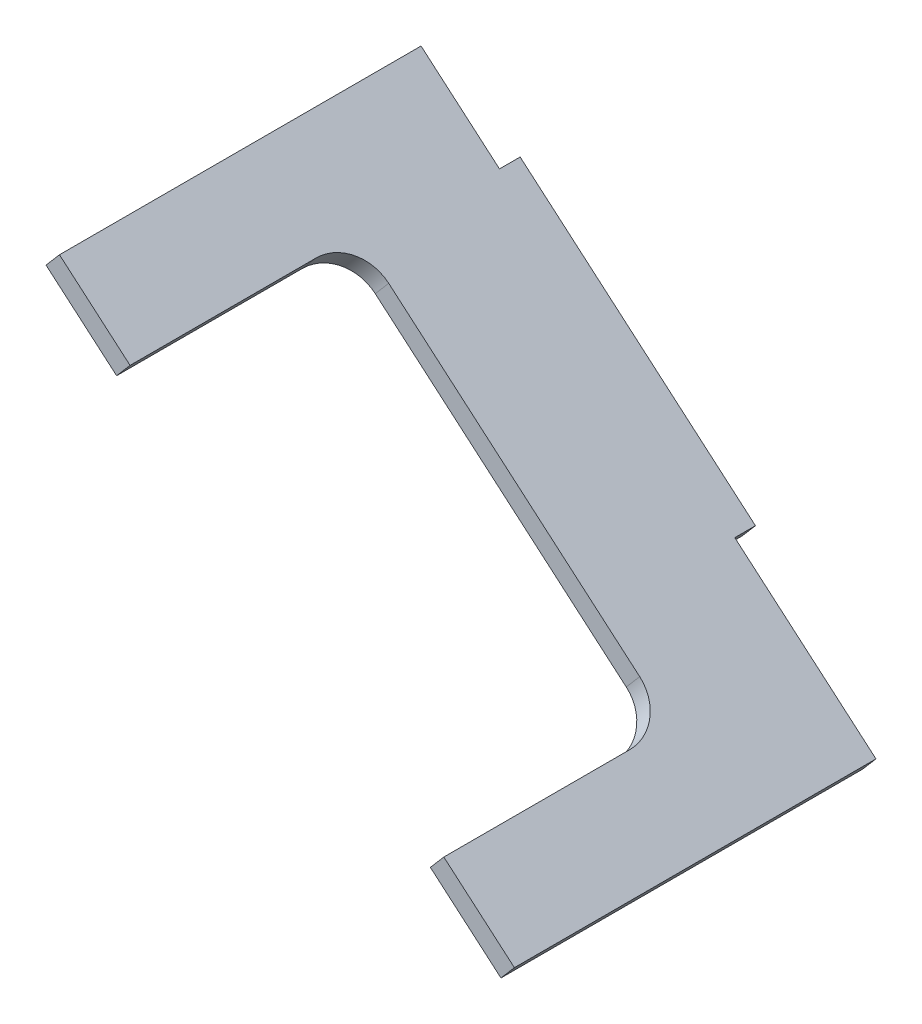
ISO-10303-21;
HEADER;
FILE_DESCRIPTION(('STEP AP214'),'2;1');
FILE_NAME('part.step','',(''),(''),'','','');
FILE_SCHEMA(('AUTOMOTIVE_DESIGN { 1 0 10303 214 1 1 1 1 }'));
ENDSEC;
DATA;
#1=APPLICATION_CONTEXT('core data for automotive mechanical design processes');
#2=APPLICATION_PROTOCOL_DEFINITION('international standard','automotive_design',2000,#1);
#3=PRODUCT_CONTEXT('',#1,'mechanical');
#4=PRODUCT('Part','Part','',(#3));
#5=PRODUCT_RELATED_PRODUCT_CATEGORY('part','',(#4));
#6=PRODUCT_DEFINITION_FORMATION('','',#4);
#7=PRODUCT_DEFINITION_CONTEXT('part definition',#1,'design');
#8=PRODUCT_DEFINITION('design','',#6,#7);
#9=PRODUCT_DEFINITION_SHAPE('','',#8);
#10=(LENGTH_UNIT() NAMED_UNIT(*) SI_UNIT(.MILLI.,.METRE.));
#11=(NAMED_UNIT(*) PLANE_ANGLE_UNIT() SI_UNIT($,.RADIAN.));
#12=(NAMED_UNIT(*) SI_UNIT($,.STERADIAN.) SOLID_ANGLE_UNIT());
#13=UNCERTAINTY_MEASURE_WITH_UNIT(LENGTH_MEASURE(1.E-05),#10,'distance_accuracy_value','');
#14=(GEOMETRIC_REPRESENTATION_CONTEXT(3) GLOBAL_UNCERTAINTY_ASSIGNED_CONTEXT((#13)) GLOBAL_UNIT_ASSIGNED_CONTEXT((#10,
#11,#12)) REPRESENTATION_CONTEXT('',''));
#15=CARTESIAN_POINT('',(0.,0.,0.));
#16=DIRECTION('',(0.,0.,1.));
#17=DIRECTION('',(1.,0.,0.));
#18=AXIS2_PLACEMENT_3D('',#15,#16,#17);
#19=CARTESIAN_POINT('',(-143.999999999999,-1.79066830807706E-12,35.));
#20=DIRECTION('',(0.,0.,-1.));
#21=DIRECTION('',(0.,1.,0.));
#22=AXIS2_PLACEMENT_3D('',#19,#20,#21);
#23=PLANE('',#22);
#24=DIRECTION('',(-0.759272473775862,0.650772856353339,0.));
#25=VECTOR('',#24,1.);
#26=CARTESIAN_POINT('',(30.6663228878355,65.0384694265857,35.));
#27=LINE('',#26,#25);
#28=CARTESIAN_POINT('',(29.9070504140597,65.6892422829391,35.));
#29=VERTEX_POINT('',#28);
#30=CARTESIAN_POINT('',(23.0735981500769,71.5461979901191,35.));
#31=VERTEX_POINT('',#30);
#32=EDGE_CURVE('E147',#29,#31,#27,.T.);
#33=ORIENTED_EDGE('',*,*,#32,.F.);
#34=DIRECTION('',(0.650772856353339,0.759272473775862,0.));
#35=VECTOR('',#34,1.);
#36=CARTESIAN_POINT('',(-76.2014777581834,-58.1101508348213,35.));
#37=LINE('',#36,#35);
#38=CARTESIAN_POINT('',(31.2085961267664,67.2077872304908,35.));
#39=VERTEX_POINT('',#38);
#40=EDGE_CURVE('E136',#29,#39,#37,.T.);
#41=ORIENTED_EDGE('',*,*,#40,.T.);
#42=DIRECTION('',(0.759272473775862,-0.650772856353339,0.));
#43=VECTOR('',#42,1.);
#44=CARTESIAN_POINT('',(54.746042813818,47.0338286835373,35.));
#45=LINE('',#44,#43);
#46=CARTESIAN_POINT('',(24.3751438627836,73.0647429376708,35.));
#47=VERTEX_POINT('',#46);
#48=EDGE_CURVE('E145',#47,#39,#45,.T.);
#49=ORIENTED_EDGE('',*,*,#48,.F.);
#50=DIRECTION('',(-0.650772856353339,-0.759272473775862,0.));
#51=VECTOR('',#50,1.);
#52=CARTESIAN_POINT('',(49.9878306813736,102.947685796981,35.));
#53=LINE('',#52,#51);
#54=EDGE_CURVE('E214',#47,#31,#53,.T.);
#55=ORIENTED_EDGE('',*,*,#54,.T.);
#56=EDGE_LOOP('',(#33,#41,#49,#55));
#57=FACE_BOUND('',#56,.T.);
#58=ADVANCED_FACE('F33',(#57),#23,.F.);
#59=CARTESIAN_POINT('',(31.9678686005422,66.5570143741374,66.9779195690136));
#60=DIRECTION('',(0.759272473775864,-0.650772856353336,0.));
#61=DIRECTION('',(0.650772856353336,0.759272473775864,0.));
#62=AXIS2_PLACEMENT_3D('',#59,#60,#61);
#63=PLANE('',#62);
#64=DIRECTION('',(-0.650772856353339,-0.759272473775862,0.));
#65=VECTOR('',#64,1.);
#66=CARTESIAN_POINT('',(57.5805554191322,96.4399572334481,0.));
#67=LINE('',#66,#65);
#68=CARTESIAN_POINT('',(31.9678686005422,66.5570143741374,0.));
#69=VERTEX_POINT('',#68);
#70=CARTESIAN_POINT('',(30.6663228878355,65.0384694265857,0.));
#71=VERTEX_POINT('',#70);
#72=EDGE_CURVE('E197',#69,#71,#67,.T.);
#73=ORIENTED_EDGE('',*,*,#72,.F.);
#74=DIRECTION('',(0.,0.,-1.));
#75=VECTOR('',#74,1.);
#76=CARTESIAN_POINT('',(31.9678686005422,66.5570143741374,66.9779195690136));
#77=LINE('',#76,#75);
#78=CARTESIAN_POINT('',(31.9678686005422,66.5570143741374,-1.99999999999999));
#79=VERTEX_POINT('',#78);
#80=EDGE_CURVE('E210',#69,#79,#77,.T.);
#81=ORIENTED_EDGE('',*,*,#80,.T.);
#82=DIRECTION('',(-0.650772856353336,-0.759272473775864,0.));
#83=VECTOR('',#82,1.);
#84=CARTESIAN_POINT('',(31.9678686005422,66.5570143741374,-1.99999999999999));
#85=LINE('',#84,#83);
#86=CARTESIAN_POINT('',(30.6663228878355,65.0384694265857,-1.99999999999999));
#87=VERTEX_POINT('',#86);
#88=EDGE_CURVE('E162',#79,#87,#85,.T.);
#89=ORIENTED_EDGE('',*,*,#88,.T.);
#90=DIRECTION('',(0.,0.,-1.));
#91=VECTOR('',#90,1.);
#92=CARTESIAN_POINT('',(30.6663228878355,65.0384694265857,66.9779195690136));
#93=LINE('',#92,#91);
#94=EDGE_CURVE('E172',#71,#87,#93,.T.);
#95=ORIENTED_EDGE('',*,*,#94,.F.);
#96=EDGE_LOOP('',(#73,#81,#89,#95));
#97=FACE_BOUND('',#96,.T.);
#98=ADVANCED_FACE('F238',(#97),#63,.F.);
#99=CARTESIAN_POINT('',(30.6663228878355,65.0384694265857,66.9779195690136));
#100=DIRECTION('',(0.650772856353339,0.759272473775862,0.));
#101=DIRECTION('',(-0.759272473775862,0.650772856353339,0.));
#102=AXIS2_PLACEMENT_3D('',#99,#100,#101);
#103=PLANE('',#102);
#104=DIRECTION('',(0.,0.,-1.));
#105=VECTOR('',#104,1.);
#106=CARTESIAN_POINT('',(60.2779493650941,39.6583280288055,66.9779195690136));
#107=LINE('',#106,#105);
#108=CARTESIAN_POINT('',(60.2779493650942,39.6583280288055,35.));
#109=VERTEX_POINT('',#108);
#110=CARTESIAN_POINT('',(60.2779493650941,39.6583280288055,17.));
#111=VERTEX_POINT('',#110);
#112=EDGE_CURVE('E339',#109,#111,#107,.T.);
#113=ORIENTED_EDGE('',*,*,#112,.T.);
#114=CARTESIAN_POINT('',(57.2408594699907,42.2614194542188,17.));
#115=DIRECTION('',(0.650772856353339,0.759272473775862,0.));
#116=DIRECTION('',(-0.759272473775862,0.650772856353339,0.));
#117=AXIS2_PLACEMENT_3D('',#114,#115,#116);
#118=CIRCLE('',#117,4.);
#119=CARTESIAN_POINT('',(57.2408594699907,42.2614194542188,13.));
#120=VERTEX_POINT('',#119);
#121=EDGE_CURVE('E328',#111,#120,#118,.T.);
#122=ORIENTED_EDGE('',*,*,#121,.T.);
#123=DIRECTION('',(-0.759272473775862,0.650772856353339,0.));
#124=VECTOR('',#123,1.);
#125=CARTESIAN_POINT('',(30.6663228878355,65.0384694265857,13.));
#126=LINE('',#125,#124);
#127=CARTESIAN_POINT('',(32.9441403091631,63.0861508575257,13.));
#128=VERTEX_POINT('',#127);
#129=EDGE_CURVE('E181',#120,#128,#126,.T.);
#130=ORIENTED_EDGE('',*,*,#129,.T.);
#131=CARTESIAN_POINT('',(32.9441403091631,63.0861508575257,17.));
#132=DIRECTION('',(0.650772856353339,0.759272473775862,0.));
#133=DIRECTION('',(-0.759272473775862,0.650772856353339,0.));
#134=AXIS2_PLACEMENT_3D('',#131,#132,#133);
#135=CIRCLE('',#134,4.);
#136=CARTESIAN_POINT('',(29.9070504140597,65.689242282939,17.));
#137=VERTEX_POINT('',#136);
#138=EDGE_CURVE('E11',#128,#137,#135,.T.);
#139=ORIENTED_EDGE('',*,*,#138,.T.);
#140=DIRECTION('',(0.,0.,1.));
#141=VECTOR('',#140,1.);
#142=CARTESIAN_POINT('',(29.9070504140597,65.689242282939,66.9779195690136));
#143=LINE('',#142,#141);
#144=EDGE_CURVE('E246',#137,#29,#143,.T.);
#145=ORIENTED_EDGE('',*,*,#144,.T.);
#146=ORIENTED_EDGE('',*,*,#32,.T.);
#147=DIRECTION('',(0.,0.,-1.));
#148=VECTOR('',#147,1.);
#149=CARTESIAN_POINT('',(23.0735981500769,71.5461979901191,0.));
#150=LINE('',#149,#148);
#151=CARTESIAN_POINT('',(23.0735981500769,71.5461979901191,0.));
#152=VERTEX_POINT('',#151);
#153=EDGE_CURVE('E198',#31,#152,#150,.T.);
#154=ORIENTED_EDGE('',*,*,#153,.T.);
#155=DIRECTION('',(0.759272473775862,-0.650772856353338,0.));
#156=VECTOR('',#155,1.);
#157=CARTESIAN_POINT('',(30.6663228878355,65.0384694265857,0.));
#158=LINE('',#157,#156);
#159=EDGE_CURVE('E201',#152,#71,#158,.T.);
#160=ORIENTED_EDGE('',*,*,#159,.T.);
#161=ORIENTED_EDGE('',*,*,#94,.T.);
#162=DIRECTION('',(0.759272473775862,-0.650772856353339,0.));
#163=VECTOR('',#162,1.);
#164=CARTESIAN_POINT('',(30.6663228878355,65.0384694265857,-1.99999999999999));
#165=LINE('',#164,#163);
#166=CARTESIAN_POINT('',(53.4444971011114,45.5152837359855,-1.99999999999999));
#167=VERTEX_POINT('',#166);
#168=EDGE_CURVE('E225',#87,#167,#165,.T.);
#169=ORIENTED_EDGE('',*,*,#168,.T.);
#170=DIRECTION('',(0.,0.,-1.));
#171=VECTOR('',#170,1.);
#172=CARTESIAN_POINT('',(53.4444971011114,45.5152837359855,66.9779195690136));
#173=LINE('',#172,#171);
#174=CARTESIAN_POINT('',(53.4444971011114,45.5152837359855,0.));
#175=VERTEX_POINT('',#174);
#176=EDGE_CURVE('E169',#175,#167,#173,.T.);
#177=ORIENTED_EDGE('',*,*,#176,.F.);
#178=DIRECTION('',(0.759272473775862,-0.650772856353339,0.));
#179=VECTOR('',#178,1.);
#180=CARTESIAN_POINT('',(53.4444971011114,45.5152837359855,0.));
#181=LINE('',#180,#179);
#182=CARTESIAN_POINT('',(67.1114016290769,33.8013723216254,0.));
#183=VERTEX_POINT('',#182);
#184=EDGE_CURVE('E177',#175,#183,#181,.T.);
#185=ORIENTED_EDGE('',*,*,#184,.T.);
#186=DIRECTION('',(0.,0.,1.));
#187=VECTOR('',#186,1.);
#188=CARTESIAN_POINT('',(67.1114016290769,33.8013723216254,0.));
#189=LINE('',#188,#187);
#190=CARTESIAN_POINT('',(67.1114016290769,33.8013723216254,35.));
#191=VERTEX_POINT('',#190);
#192=EDGE_CURVE('E180',#183,#191,#189,.T.);
#193=ORIENTED_EDGE('',*,*,#192,.T.);
#194=EDGE_CURVE('E159',#191,#109,#27,.T.);
#195=ORIENTED_EDGE('',*,*,#194,.T.);
#196=EDGE_LOOP('',(#113,#122,#130,#139,#145,#146,#154,#160,#161,#169,#177,#185,#193,#195));
#197=FACE_BOUND('',#196,.T.);
#198=ADVANCED_FACE('F232',(#197),#103,.F.);
#199=CARTESIAN_POINT('',(54.746042813818,47.0338286835373,66.9779195690136));
#200=DIRECTION('',(-0.650772856353338,-0.759272473775862,0.));
#201=DIRECTION('',(0.759272473775862,-0.650772856353339,0.));
#202=AXIS2_PLACEMENT_3D('',#199,#200,#201);
#203=PLANE('',#202);
#204=ORIENTED_EDGE('',*,*,#48,.T.);
#205=DIRECTION('',(0.,0.,1.));
#206=VECTOR('',#205,1.);
#207=CARTESIAN_POINT('',(31.2085961267664,67.2077872304908,35.));
#208=LINE('',#207,#206);
#209=CARTESIAN_POINT('',(31.2085961267664,67.2077872304908,17.));
#210=VERTEX_POINT('',#209);
#211=EDGE_CURVE('E133',#210,#39,#208,.T.);
#212=ORIENTED_EDGE('',*,*,#211,.F.);
#213=CARTESIAN_POINT('',(34.2456860218698,64.6046958050774,17.));
#214=DIRECTION('',(-0.650772856353338,-0.759272473775862,0.));
#215=DIRECTION('',(0.759272473775862,-0.650772856353339,0.));
#216=AXIS2_PLACEMENT_3D('',#213,#214,#215);
#217=CIRCLE('',#216,4.);
#218=CARTESIAN_POINT('',(34.2456860218698,64.6046958050774,13.));
#219=VERTEX_POINT('',#218);
#220=EDGE_CURVE('E41',#210,#219,#217,.T.);
#221=ORIENTED_EDGE('',*,*,#220,.T.);
#222=DIRECTION('',(-0.759272473775862,0.650772856353338,0.));
#223=VECTOR('',#222,1.);
#224=CARTESIAN_POINT('',(31.2085961267664,67.2077872304908,13.));
#225=LINE('',#224,#223);
#226=CARTESIAN_POINT('',(58.5424051826974,43.7799644017706,13.));
#227=VERTEX_POINT('',#226);
#228=EDGE_CURVE('E322',#227,#219,#225,.T.);
#229=ORIENTED_EDGE('',*,*,#228,.F.);
#230=CARTESIAN_POINT('',(58.5424051826974,43.7799644017706,17.));
#231=DIRECTION('',(-0.650772856353338,-0.759272473775862,0.));
#232=DIRECTION('',(0.759272473775862,-0.650772856353339,0.));
#233=AXIS2_PLACEMENT_3D('',#230,#231,#232);
#234=CIRCLE('',#233,4.);
#235=CARTESIAN_POINT('',(61.5794950778008,41.1768729763572,17.));
#236=VERTEX_POINT('',#235);
#237=EDGE_CURVE('E326',#227,#236,#234,.T.);
#238=ORIENTED_EDGE('',*,*,#237,.T.);
#239=DIRECTION('',(0.,0.,-1.));
#240=VECTOR('',#239,1.);
#241=CARTESIAN_POINT('',(61.5794950778008,41.1768729763572,35.));
#242=LINE('',#241,#240);
#243=CARTESIAN_POINT('',(61.5794950778008,41.1768729763572,35.));
#244=VERTEX_POINT('',#243);
#245=EDGE_CURVE('E141',#244,#236,#242,.T.);
#246=ORIENTED_EDGE('',*,*,#245,.F.);
#247=CARTESIAN_POINT('',(68.4129473417836,35.3199172691772,35.));
#248=VERTEX_POINT('',#247);
#249=EDGE_CURVE('E155',#244,#248,#45,.T.);
#250=ORIENTED_EDGE('',*,*,#249,.T.);
#251=DIRECTION('',(0.,0.,-1.));
#252=VECTOR('',#251,1.);
#253=CARTESIAN_POINT('',(68.4129473417836,35.3199172691772,0.));
#254=LINE('',#253,#252);
#255=CARTESIAN_POINT('',(68.4129473417836,35.3199172691771,0.));
#256=VERTEX_POINT('',#255);
#257=EDGE_CURVE('E286',#248,#256,#254,.T.);
#258=ORIENTED_EDGE('',*,*,#257,.T.);
#259=DIRECTION('',(-0.759272473775862,0.650772856353339,0.));
#260=VECTOR('',#259,1.);
#261=CARTESIAN_POINT('',(54.7460428138181,47.0338286835372,0.));
#262=LINE('',#261,#260);
#263=CARTESIAN_POINT('',(54.7460428138181,47.0338286835372,0.));
#264=VERTEX_POINT('',#263);
#265=EDGE_CURVE('E189',#256,#264,#262,.T.);
#266=ORIENTED_EDGE('',*,*,#265,.T.);
#267=DIRECTION('',(0.,0.,-1.));
#268=VECTOR('',#267,1.);
#269=CARTESIAN_POINT('',(54.746042813818,47.0338286835373,66.9779195690136));
#270=LINE('',#269,#268);
#271=CARTESIAN_POINT('',(54.746042813818,47.0338286835373,-1.99999999999999));
#272=VERTEX_POINT('',#271);
#273=EDGE_CURVE('E174',#264,#272,#270,.T.);
#274=ORIENTED_EDGE('',*,*,#273,.T.);
#275=DIRECTION('',(-0.759272473775862,0.650772856353339,0.));
#276=VECTOR('',#275,1.);
#277=CARTESIAN_POINT('',(54.746042813818,47.0338286835373,-1.99999999999999));
#278=LINE('',#277,#276);
#279=EDGE_CURVE('E217',#272,#79,#278,.T.);
#280=ORIENTED_EDGE('',*,*,#279,.T.);
#281=ORIENTED_EDGE('',*,*,#80,.F.);
#282=DIRECTION('',(-0.759272473775862,0.650772856353339,0.));
#283=VECTOR('',#282,1.);
#284=CARTESIAN_POINT('',(31.9678686005422,66.5570143741374,0.));
#285=LINE('',#284,#283);
#286=CARTESIAN_POINT('',(24.3751438627836,73.0647429376708,0.));
#287=VERTEX_POINT('',#286);
#288=EDGE_CURVE('E196',#69,#287,#285,.T.);
#289=ORIENTED_EDGE('',*,*,#288,.T.);
#290=DIRECTION('',(0.,0.,1.));
#291=VECTOR('',#290,1.);
#292=CARTESIAN_POINT('',(24.3751438627836,73.0647429376708,0.));
#293=LINE('',#292,#291);
#294=EDGE_CURVE('E153',#287,#47,#293,.T.);
#295=ORIENTED_EDGE('',*,*,#294,.T.);
#296=EDGE_LOOP('',(#204,#212,#221,#229,#238,#246,#250,#258,#266,#274,#280,#281,#289,#295));
#297=FACE_BOUND('',#296,.T.);
#298=ADVANCED_FACE('F151',(#297),#203,.F.);
#299=CARTESIAN_POINT('',(53.4444971011114,45.5152837359855,66.9779195690136));
#300=DIRECTION('',(-0.759272473775869,0.650772856353331,0.));
#301=DIRECTION('',(-0.650772856353331,-0.759272473775869,0.));
#302=AXIS2_PLACEMENT_3D('',#299,#300,#301);
#303=PLANE('',#302);
#304=ORIENTED_EDGE('',*,*,#273,.F.);
#305=DIRECTION('',(-0.650772856353339,-0.759272473775862,0.));
#306=VECTOR('',#305,1.);
#307=CARTESIAN_POINT('',(80.358729632408,76.9167715428479,0.));
#308=LINE('',#307,#306);
#309=EDGE_CURVE('E184',#264,#175,#308,.T.);
#310=ORIENTED_EDGE('',*,*,#309,.T.);
#311=ORIENTED_EDGE('',*,*,#176,.T.);
#312=DIRECTION('',(0.650772856353331,0.759272473775868,0.));
#313=VECTOR('',#312,1.);
#314=CARTESIAN_POINT('',(53.4444971011114,45.5152837359855,-1.99999999999999));
#315=LINE('',#314,#313);
#316=EDGE_CURVE('E173',#167,#272,#315,.T.);
#317=ORIENTED_EDGE('',*,*,#316,.T.);
#318=EDGE_LOOP('',(#304,#310,#311,#317));
#319=FACE_BOUND('',#318,.T.);
#320=ADVANCED_FACE('F272',(#319),#303,.F.);
#321=ORIENTED_EDGE('',*,*,#249,.F.);
#322=DIRECTION('',(-0.650772856353339,-0.759272473775862,0.));
#323=VECTOR('',#322,1.);
#324=CARTESIAN_POINT('',(-45.8305788071489,-84.1410650889548,35.));
#325=LINE('',#324,#323);
#326=EDGE_CURVE('E149',#244,#109,#325,.T.);
#327=ORIENTED_EDGE('',*,*,#326,.T.);
#328=ORIENTED_EDGE('',*,*,#194,.F.);
#329=DIRECTION('',(-0.650772856353339,-0.759272473775862,0.));
#330=VECTOR('',#329,1.);
#331=CARTESIAN_POINT('',(94.0256341603735,65.2028601284878,35.));
#332=LINE('',#331,#330);
#333=EDGE_CURVE('E283',#248,#191,#332,.T.);
#334=ORIENTED_EDGE('',*,*,#333,.F.);
#335=EDGE_LOOP('',(#321,#327,#328,#334));
#336=FACE_BOUND('',#335,.T.);
#337=ADVANCED_FACE('F260',(#336),#23,.F.);
#338=CARTESIAN_POINT('',(6.93889390390723E-13,-1.77548947766226E-12,-1.99999999999999));
#339=DIRECTION('',(0.,0.,-1.));
#340=DIRECTION('',(-1.,0.,0.));
#341=AXIS2_PLACEMENT_3D('',#338,#339,#340);
#342=PLANE('',#341);
#343=ORIENTED_EDGE('',*,*,#316,.F.);
#344=ORIENTED_EDGE('',*,*,#168,.F.);
#345=ORIENTED_EDGE('',*,*,#88,.F.);
#346=ORIENTED_EDGE('',*,*,#279,.F.);
#347=EDGE_LOOP('',(#343,#344,#345,#346));
#348=FACE_BOUND('',#347,.T.);
#349=ADVANCED_FACE('F236',(#348),#342,.T.);
#350=CARTESIAN_POINT('',(57.5805554191322,96.4399572334481,0.));
#351=DIRECTION('',(0.,0.,-1.));
#352=DIRECTION('',(-1.,0.,0.));
#353=AXIS2_PLACEMENT_3D('',#350,#351,#352);
#354=PLANE('',#353);
#355=ORIENTED_EDGE('',*,*,#288,.F.);
#356=ORIENTED_EDGE('',*,*,#72,.T.);
#357=ORIENTED_EDGE('',*,*,#159,.F.);
#358=DIRECTION('',(-0.650772856353339,-0.759272473775862,0.));
#359=VECTOR('',#358,1.);
#360=CARTESIAN_POINT('',(49.9878306813736,102.947685796981,0.));
#361=LINE('',#360,#359);
#362=EDGE_CURVE('E204',#287,#152,#361,.T.);
#363=ORIENTED_EDGE('',*,*,#362,.F.);
#364=EDGE_LOOP('',(#355,#356,#357,#363));
#365=FACE_BOUND('',#364,.T.);
#366=ADVANCED_FACE('F251',(#365),#354,.T.);
#367=CARTESIAN_POINT('',(49.9878306813736,102.947685796981,0.));
#368=DIRECTION('',(-0.759272473775862,0.650772856353339,0.));
#369=DIRECTION('',(-0.650772856353339,-0.759272473775862,0.));
#370=AXIS2_PLACEMENT_3D('',#367,#368,#369);
#371=PLANE('',#370);
#372=ORIENTED_EDGE('',*,*,#294,.F.);
#373=ORIENTED_EDGE('',*,*,#362,.T.);
#374=ORIENTED_EDGE('',*,*,#153,.F.);
#375=ORIENTED_EDGE('',*,*,#54,.F.);
#376=EDGE_LOOP('',(#372,#373,#374,#375));
#377=FACE_BOUND('',#376,.T.);
#378=ADVANCED_FACE('F248',(#377),#371,.T.);
#379=CARTESIAN_POINT('',(94.0256341603735,65.2028601284878,0.));
#380=DIRECTION('',(0.759272473775862,-0.650772856353339,0.));
#381=DIRECTION('',(0.650772856353339,0.759272473775862,0.));
#382=AXIS2_PLACEMENT_3D('',#379,#380,#381);
#383=PLANE('',#382);
#384=ORIENTED_EDGE('',*,*,#257,.F.);
#385=ORIENTED_EDGE('',*,*,#333,.T.);
#386=ORIENTED_EDGE('',*,*,#192,.F.);
#387=DIRECTION('',(-0.650772856353339,-0.759272473775862,0.));
#388=VECTOR('',#387,1.);
#389=CARTESIAN_POINT('',(94.0256341603735,65.2028601284878,0.));
#390=LINE('',#389,#388);
#391=EDGE_CURVE('E188',#256,#183,#390,.T.);
#392=ORIENTED_EDGE('',*,*,#391,.F.);
#393=EDGE_LOOP('',(#384,#385,#386,#392));
#394=FACE_BOUND('',#393,.T.);
#395=ADVANCED_FACE('F258',(#394),#383,.T.);
#396=CARTESIAN_POINT('',(80.358729632408,76.9167715428479,0.));
#397=DIRECTION('',(0.,0.,-1.));
#398=DIRECTION('',(-1.,0.,0.));
#399=AXIS2_PLACEMENT_3D('',#396,#397,#398);
#400=PLANE('',#399);
#401=ORIENTED_EDGE('',*,*,#265,.F.);
#402=ORIENTED_EDGE('',*,*,#391,.T.);
#403=ORIENTED_EDGE('',*,*,#184,.F.);
#404=ORIENTED_EDGE('',*,*,#309,.F.);
#405=EDGE_LOOP('',(#401,#402,#403,#404));
#406=FACE_BOUND('',#405,.T.);
#407=ADVANCED_FACE('F298',(#406),#400,.T.);
#408=CARTESIAN_POINT('',(24.700867563233,59.6150624927322,13.));
#409=DIRECTION('',(0.,0.,-1.));
#410=DIRECTION('',(-1.,0.,0.));
#411=AXIS2_PLACEMENT_3D('',#408,#409,#410);
#412=PLANE('',#411);
#413=ORIENTED_EDGE('',*,*,#129,.F.);
#414=DIRECTION('',(0.650772856353339,0.759272473775862,0.));
#415=VECTOR('',#414,1.);
#416=CARTESIAN_POINT('',(58.5424051826974,43.7799644017706,13.));
#417=LINE('',#416,#415);
#418=EDGE_CURVE('E329',#120,#227,#417,.T.);
#419=ORIENTED_EDGE('',*,*,#418,.T.);
#420=ORIENTED_EDGE('',*,*,#228,.T.);
#421=DIRECTION('',(0.650772856353339,0.759272473775862,0.));
#422=VECTOR('',#421,1.);
#423=CARTESIAN_POINT('',(32.9441403091631,63.0861508575257,13.));
#424=LINE('',#423,#422);
#425=EDGE_CURVE('E148',#219,#128,#424,.F.);
#426=ORIENTED_EDGE('',*,*,#425,.T.);
#427=EDGE_LOOP('',(#413,#419,#420,#426));
#428=FACE_BOUND('',#427,.T.);
#429=ADVANCED_FACE('F301',(#428),#412,.F.);
#430=CARTESIAN_POINT('',(24.700867563233,59.6150624927322,35.));
#431=DIRECTION('',(-0.759272473775862,0.650772856353339,0.));
#432=DIRECTION('',(-0.650772856353339,-0.759272473775862,0.));
#433=AXIS2_PLACEMENT_3D('',#430,#431,#432);
#434=PLANE('',#433);
#435=ORIENTED_EDGE('',*,*,#144,.F.);
#436=DIRECTION('',(0.650772856353339,0.759272473775862,0.));
#437=VECTOR('',#436,1.);
#438=CARTESIAN_POINT('',(31.2085961267664,67.2077872304908,17.));
#439=LINE('',#438,#437);
#440=EDGE_CURVE('E138',#137,#210,#439,.T.);
#441=ORIENTED_EDGE('',*,*,#440,.T.);
#442=ORIENTED_EDGE('',*,*,#211,.T.);
#443=ORIENTED_EDGE('',*,*,#40,.F.);
#444=EDGE_LOOP('',(#435,#441,#442,#443));
#445=FACE_BOUND('',#444,.T.);
#446=ADVANCED_FACE('F135',(#445),#434,.F.);
#447=CARTESIAN_POINT('',(55.0717665142674,33.5841482385986,35.));
#448=DIRECTION('',(0.759272473775862,-0.650772856353339,0.));
#449=DIRECTION('',(0.650772856353339,0.759272473775862,0.));
#450=AXIS2_PLACEMENT_3D('',#447,#448,#449);
#451=PLANE('',#450);
#452=ORIENTED_EDGE('',*,*,#245,.T.);
#453=DIRECTION('',(0.650772856353339,0.759272473775862,0.));
#454=VECTOR('',#453,1.);
#455=CARTESIAN_POINT('',(60.2779493650941,39.6583280288055,17.));
#456=LINE('',#455,#454);
#457=EDGE_CURVE('E321',#236,#111,#456,.F.);
#458=ORIENTED_EDGE('',*,*,#457,.T.);
#459=ORIENTED_EDGE('',*,*,#112,.F.);
#460=ORIENTED_EDGE('',*,*,#326,.F.);
#461=EDGE_LOOP('',(#452,#458,#459,#460));
#462=FACE_BOUND('',#461,.T.);
#463=ADVANCED_FACE('F312',(#462),#451,.F.);
#464=CARTESIAN_POINT('',(52.034676619164,36.187239664012,17.));
#465=DIRECTION('',(-0.650772856353339,-0.759272473775862,0.));
#466=DIRECTION('',(0.759272473775862,-0.650772856353339,0.));
#467=AXIS2_PLACEMENT_3D('',#464,#465,#466);
#468=CYLINDRICAL_SURFACE('',#467,4.);
#469=ORIENTED_EDGE('',*,*,#121,.F.);
#470=ORIENTED_EDGE('',*,*,#457,.F.);
#471=ORIENTED_EDGE('',*,*,#237,.F.);
#472=ORIENTED_EDGE('',*,*,#418,.F.);
#473=EDGE_LOOP('',(#469,#470,#471,#472));
#474=FACE_BOUND('',#473,.T.);
#475=ADVANCED_FACE('F314',(#474),#468,.F.);
#476=CARTESIAN_POINT('',(27.7379574583364,57.0119710673188,17.));
#477=DIRECTION('',(-0.650772856353339,-0.759272473775862,0.));
#478=DIRECTION('',(0.759272473775862,-0.650772856353339,0.));
#479=AXIS2_PLACEMENT_3D('',#476,#477,#478);
#480=CYLINDRICAL_SURFACE('',#479,4.);
#481=ORIENTED_EDGE('',*,*,#138,.F.);
#482=ORIENTED_EDGE('',*,*,#425,.F.);
#483=ORIENTED_EDGE('',*,*,#220,.F.);
#484=ORIENTED_EDGE('',*,*,#440,.F.);
#485=EDGE_LOOP('',(#481,#482,#483,#484));
#486=FACE_BOUND('',#485,.T.);
#487=ADVANCED_FACE('F35',(#486),#480,.F.);
#488=CLOSED_SHELL('',(#58,#98,#198,#298,#320,#337,#349,#366,#378,#395,#407,#429,#446,#463,#475,#487));
#489=MANIFOLD_SOLID_BREP('B2',#488);
#490=ADVANCED_BREP_SHAPE_REPRESENTATION('',(#18,#489),#14);
#491=SHAPE_DEFINITION_REPRESENTATION(#9,#490);
ENDSEC;
END-ISO-10303-21;
